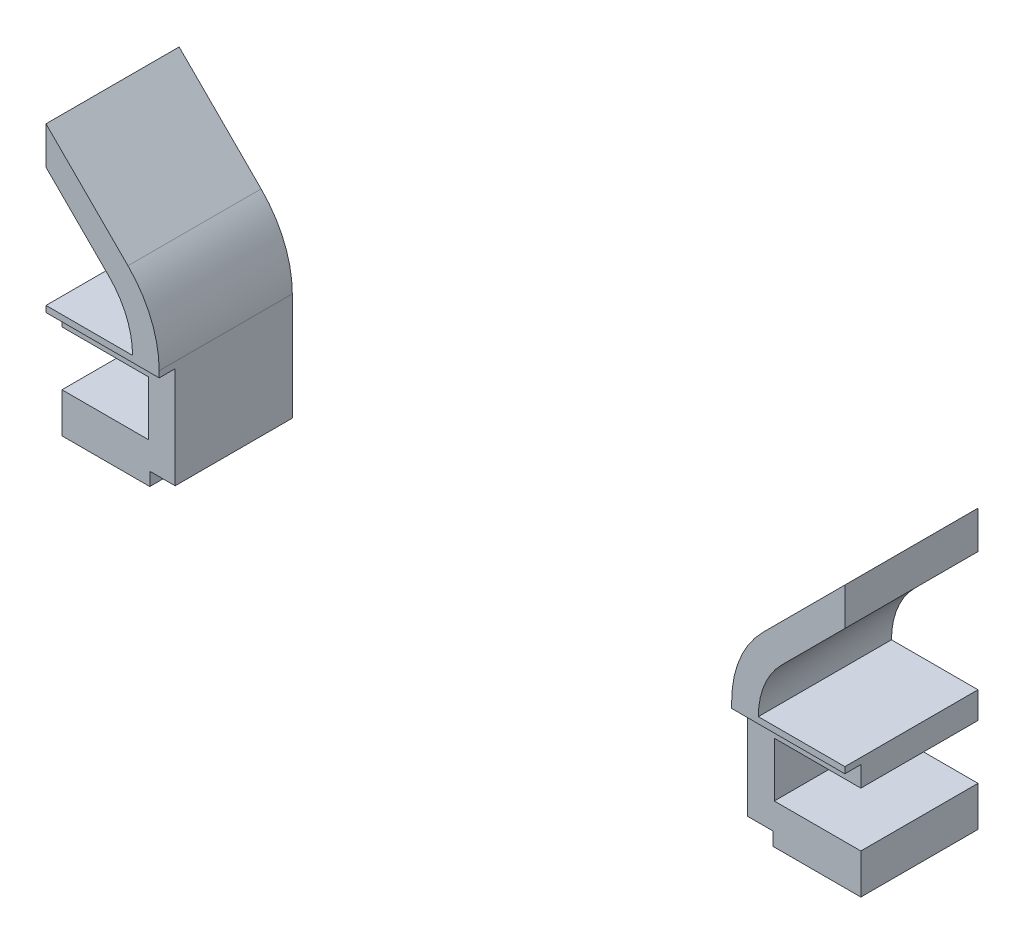
ISO-10303-21;
HEADER;
FILE_DESCRIPTION(('STEP AP214'),'2;1');
FILE_NAME('part.step','',(''),(''),'','','');
FILE_SCHEMA(('AUTOMOTIVE_DESIGN { 1 0 10303 214 1 1 1 1 }'));
ENDSEC;
DATA;
#1=APPLICATION_CONTEXT('core data for automotive mechanical design processes');
#2=APPLICATION_PROTOCOL_DEFINITION('international standard','automotive_design',2000,#1);
#3=PRODUCT_CONTEXT('',#1,'mechanical');
#4=PRODUCT('Part','Part','',(#3));
#5=PRODUCT_RELATED_PRODUCT_CATEGORY('part','',(#4));
#6=PRODUCT_DEFINITION_FORMATION('','',#4);
#7=PRODUCT_DEFINITION_CONTEXT('part definition',#1,'design');
#8=PRODUCT_DEFINITION('design','',#6,#7);
#9=PRODUCT_DEFINITION_SHAPE('','',#8);
#10=(LENGTH_UNIT() NAMED_UNIT(*) SI_UNIT(.MILLI.,.METRE.));
#11=(NAMED_UNIT(*) PLANE_ANGLE_UNIT() SI_UNIT($,.RADIAN.));
#12=(NAMED_UNIT(*) SI_UNIT($,.STERADIAN.) SOLID_ANGLE_UNIT());
#13=UNCERTAINTY_MEASURE_WITH_UNIT(LENGTH_MEASURE(1.E-05),#10,'distance_accuracy_value','');
#14=(GEOMETRIC_REPRESENTATION_CONTEXT(3) GLOBAL_UNCERTAINTY_ASSIGNED_CONTEXT((#13)) GLOBAL_UNIT_ASSIGNED_CONTEXT((#10,
#11,#12)) REPRESENTATION_CONTEXT('',''));
#15=CARTESIAN_POINT('',(0.,0.,0.));
#16=DIRECTION('',(0.,0.,1.));
#17=DIRECTION('',(1.,0.,0.));
#18=AXIS2_PLACEMENT_3D('',#15,#16,#17);
#19=CARTESIAN_POINT('',(-234.05,-125.,316.393160705231));
#20=DIRECTION('',(0.,1.,0.));
#21=DIRECTION('',(1.,0.,0.));
#22=AXIS2_PLACEMENT_3D('',#19,#20,#21);
#23=PLANE('',#22);
#24=DIRECTION('',(0.,0.,-1.));
#25=VECTOR('',#24,1.);
#26=CARTESIAN_POINT('',(-234.05,-125.,0.));
#27=LINE('',#26,#25);
#28=CARTESIAN_POINT('',(-234.05,-125.,88.));
#29=VERTEX_POINT('',#28);
#30=CARTESIAN_POINT('',(-234.05,-125.,0.));
#31=VERTEX_POINT('',#30);
#32=EDGE_CURVE('E191',#29,#31,#27,.T.);
#33=ORIENTED_EDGE('',*,*,#32,.T.);
#34=DIRECTION('',(-1.,0.,0.));
#35=VECTOR('',#34,1.);
#36=CARTESIAN_POINT('',(-234.05,-125.,0.));
#37=LINE('',#36,#35);
#38=CARTESIAN_POINT('',(-215.,-125.,0.));
#39=VERTEX_POINT('',#38);
#40=EDGE_CURVE('E185',#39,#31,#37,.T.);
#41=ORIENTED_EDGE('',*,*,#40,.F.);
#42=DIRECTION('',(0.,0.,-1.));
#43=VECTOR('',#42,1.);
#44=CARTESIAN_POINT('',(-215.,-125.,316.393160705231));
#45=LINE('',#44,#43);
#46=CARTESIAN_POINT('',(-215.,-125.,88.));
#47=VERTEX_POINT('',#46);
#48=EDGE_CURVE('E287',#47,#39,#45,.T.);
#49=ORIENTED_EDGE('',*,*,#48,.F.);
#50=DIRECTION('',(1.,0.,0.));
#51=VECTOR('',#50,1.);
#52=CARTESIAN_POINT('',(-300.,-125.,88.));
#53=LINE('',#52,#51);
#54=EDGE_CURVE('E208',#29,#47,#53,.T.);
#55=ORIENTED_EDGE('',*,*,#54,.F.);
#56=EDGE_LOOP('',(#33,#41,#49,#55));
#57=FACE_BOUND('',#56,.T.);
#58=ADVANCED_FACE('F43',(#57),#23,.F.);
#59=CARTESIAN_POINT('',(-295.,-44.1370849898474,0.));
#60=DIRECTION('',(0.,0.,1.));
#61=DIRECTION('',(-1.,0.,0.));
#62=AXIS2_PLACEMENT_3D('',#59,#60,#61);
#63=PLANE('',#62);
#64=DIRECTION('',(0.,1.,0.));
#65=VECTOR('',#64,1.);
#66=CARTESIAN_POINT('',(-300.,74.,0.));
#67=LINE('',#66,#65);
#68=CARTESIAN_POINT('',(-300.,45.7157287525382,0.));
#69=VERTEX_POINT('',#68);
#70=CARTESIAN_POINT('',(-300.,74.,0.));
#71=VERTEX_POINT('',#70);
#72=EDGE_CURVE('E226',#69,#71,#67,.T.);
#73=ORIENTED_EDGE('',*,*,#72,.T.);
#74=DIRECTION('',(0.707106781186548,-0.707106781186547,0.));
#75=VECTOR('',#74,1.);
#76=CARTESIAN_POINT('',(-300.,74.,0.));
#77=LINE('',#76,#75);
#78=CARTESIAN_POINT('',(-238.431457505076,12.4314575050767,0.));
#79=VERTEX_POINT('',#78);
#80=EDGE_CURVE('E244',#71,#79,#77,.T.);
#81=ORIENTED_EDGE('',*,*,#80,.T.);
#82=CARTESIAN_POINT('',(-295.,-44.1370849898474,0.));
#83=DIRECTION('',(0.,0.,-1.));
#84=DIRECTION('',(-1.,0.,0.));
#85=AXIS2_PLACEMENT_3D('',#82,#83,#84);
#86=CIRCLE('',#85,80.);
#87=CARTESIAN_POINT('',(-215.,-44.1370849898474,0.));
#88=VERTEX_POINT('',#87);
#89=EDGE_CURVE('E247',#79,#88,#86,.T.);
#90=ORIENTED_EDGE('',*,*,#89,.T.);
#91=DIRECTION('',(0.,-1.,0.));
#92=VECTOR('',#91,1.);
#93=CARTESIAN_POINT('',(-215.,-125.,0.));
#94=LINE('',#93,#92);
#95=EDGE_CURVE('E250',#88,#39,#94,.T.);
#96=ORIENTED_EDGE('',*,*,#95,.T.);
#97=ORIENTED_EDGE('',*,*,#40,.T.);
#98=DIRECTION('',(0.,1.,0.));
#99=VECTOR('',#98,1.);
#100=CARTESIAN_POINT('',(-234.05,-135.,0.));
#101=LINE('',#100,#99);
#102=CARTESIAN_POINT('',(-234.05,-135.,0.));
#103=VERTEX_POINT('',#102);
#104=EDGE_CURVE('E190',#103,#31,#101,.T.);
#105=ORIENTED_EDGE('',*,*,#104,.F.);
#106=DIRECTION('',(-1.,0.,0.));
#107=VECTOR('',#106,1.);
#108=CARTESIAN_POINT('',(-300.,-135.,0.));
#109=LINE('',#108,#107);
#110=CARTESIAN_POINT('',(-300.,-135.,0.));
#111=VERTEX_POINT('',#110);
#112=EDGE_CURVE('E170',#103,#111,#109,.T.);
#113=ORIENTED_EDGE('',*,*,#112,.T.);
#114=DIRECTION('',(0.,1.,0.));
#115=VECTOR('',#114,1.);
#116=CARTESIAN_POINT('',(-300.,-125.,0.));
#117=LINE('',#116,#115);
#118=CARTESIAN_POINT('',(-300.,-105.,0.));
#119=VERTEX_POINT('',#118);
#120=EDGE_CURVE('E177',#111,#119,#117,.T.);
#121=ORIENTED_EDGE('',*,*,#120,.T.);
#122=DIRECTION('',(1.,0.,0.));
#123=VECTOR('',#122,1.);
#124=CARTESIAN_POINT('',(-235.,-105.,0.));
#125=LINE('',#124,#123);
#126=CARTESIAN_POINT('',(-235.,-105.,0.));
#127=VERTEX_POINT('',#126);
#128=EDGE_CURVE('E184',#119,#127,#125,.T.);
#129=ORIENTED_EDGE('',*,*,#128,.T.);
#130=DIRECTION('',(0.,1.,0.));
#131=VECTOR('',#130,1.);
#132=CARTESIAN_POINT('',(-235.,-105.,0.));
#133=LINE('',#132,#131);
#134=CARTESIAN_POINT('',(-235.,-64.1370849898474,0.));
#135=VERTEX_POINT('',#134);
#136=EDGE_CURVE('E254',#127,#135,#133,.T.);
#137=ORIENTED_EDGE('',*,*,#136,.T.);
#138=DIRECTION('',(-1.,0.,0.));
#139=VECTOR('',#138,1.);
#140=CARTESIAN_POINT('',(-300.,-64.1370849898474,0.));
#141=LINE('',#140,#139);
#142=CARTESIAN_POINT('',(-300.,-64.1370849898474,0.));
#143=VERTEX_POINT('',#142);
#144=EDGE_CURVE('E257',#135,#143,#141,.T.);
#145=ORIENTED_EDGE('',*,*,#144,.T.);
#146=DIRECTION('',(0.,1.,0.));
#147=VECTOR('',#146,1.);
#148=CARTESIAN_POINT('',(-300.,-44.1370849898474,0.));
#149=LINE('',#148,#147);
#150=CARTESIAN_POINT('',(-300.,-44.1370849898474,0.));
#151=VERTEX_POINT('',#150);
#152=EDGE_CURVE('E260',#143,#151,#149,.T.);
#153=ORIENTED_EDGE('',*,*,#152,.T.);
#154=DIRECTION('',(1.,0.,0.));
#155=VECTOR('',#154,1.);
#156=CARTESIAN_POINT('',(-235.,-44.1370849898474,0.));
#157=LINE('',#156,#155);
#158=CARTESIAN_POINT('',(-235.,-44.1370849898474,0.));
#159=VERTEX_POINT('',#158);
#160=EDGE_CURVE('E263',#151,#159,#157,.T.);
#161=ORIENTED_EDGE('',*,*,#160,.T.);
#162=CARTESIAN_POINT('',(-295.,-44.1370849898474,0.));
#163=DIRECTION('',(0.,0.,1.));
#164=DIRECTION('',(-1.,0.,0.));
#165=AXIS2_PLACEMENT_3D('',#162,#163,#164);
#166=CIRCLE('',#165,60.);
#167=CARTESIAN_POINT('',(-252.573593128807,-1.71067811865435,0.));
#168=VERTEX_POINT('',#167);
#169=EDGE_CURVE('E266',#159,#168,#166,.T.);
#170=ORIENTED_EDGE('',*,*,#169,.T.);
#171=DIRECTION('',(-0.707106781186549,0.707106781186546,0.));
#172=VECTOR('',#171,1.);
#173=CARTESIAN_POINT('',(-300.,45.7157287525382,0.));
#174=LINE('',#173,#172);
#175=EDGE_CURVE('E269',#168,#69,#174,.T.);
#176=ORIENTED_EDGE('',*,*,#175,.T.);
#177=EDGE_LOOP('',(#73,#81,#90,#96,#97,#105,#113,#121,#129,#137,#145,#153,#161,#170,#176));
#178=FACE_BOUND('',#177,.T.);
#179=ADVANCED_FACE('F188',(#178),#63,.F.);
#180=CARTESIAN_POINT('',(-300.,45.7157287525382,316.393160705231));
#181=DIRECTION('',(0.707106781186546,0.707106781186549,0.));
#182=DIRECTION('',(0.707106781186549,-0.707106781186546,0.));
#183=AXIS2_PLACEMENT_3D('',#180,#181,#182);
#184=PLANE('',#183);
#185=DIRECTION('',(0.,0.,-1.));
#186=VECTOR('',#185,1.);
#187=CARTESIAN_POINT('',(-300.,45.7157287525382,316.393160705231));
#188=LINE('',#187,#186);
#189=CARTESIAN_POINT('',(-300.,45.7157287525382,100.));
#190=VERTEX_POINT('',#189);
#191=EDGE_CURVE('E272',#190,#69,#188,.T.);
#192=ORIENTED_EDGE('',*,*,#191,.T.);
#193=ORIENTED_EDGE('',*,*,#175,.F.);
#194=DIRECTION('',(0.,0.,-1.));
#195=VECTOR('',#194,1.);
#196=CARTESIAN_POINT('',(-252.573593128807,-1.71067811865435,316.393160705231));
#197=LINE('',#196,#195);
#198=CARTESIAN_POINT('',(-252.573593128807,-1.71067811865435,100.));
#199=VERTEX_POINT('',#198);
#200=EDGE_CURVE('E274',#199,#168,#197,.T.);
#201=ORIENTED_EDGE('',*,*,#200,.F.);
#202=DIRECTION('',(0.707106781186549,-0.707106781186546,0.));
#203=VECTOR('',#202,1.);
#204=CARTESIAN_POINT('',(-300.,45.7157287525382,100.));
#205=LINE('',#204,#203);
#206=EDGE_CURVE('E47',#190,#199,#205,.T.);
#207=ORIENTED_EDGE('',*,*,#206,.F.);
#208=EDGE_LOOP('',(#192,#193,#201,#207));
#209=FACE_BOUND('',#208,.T.);
#210=ADVANCED_FACE('F307',(#209),#184,.F.);
#211=CARTESIAN_POINT('',(-295.,-44.1370849898474,316.393160705231));
#212=DIRECTION('',(0.,0.,-1.));
#213=DIRECTION('',(1.,0.,0.));
#214=AXIS2_PLACEMENT_3D('',#211,#212,#213);
#215=CYLINDRICAL_SURFACE('',#214,60.);
#216=ORIENTED_EDGE('',*,*,#200,.T.);
#217=ORIENTED_EDGE('',*,*,#169,.F.);
#218=DIRECTION('',(0.,0.,-1.));
#219=VECTOR('',#218,1.);
#220=CARTESIAN_POINT('',(-235.,-44.1370849898474,316.393160705231));
#221=LINE('',#220,#219);
#222=CARTESIAN_POINT('',(-235.,-44.1370849898474,100.));
#223=VERTEX_POINT('',#222);
#224=EDGE_CURVE('E276',#223,#159,#221,.T.);
#225=ORIENTED_EDGE('',*,*,#224,.F.);
#226=CARTESIAN_POINT('',(-295.,-44.1370849898474,100.));
#227=DIRECTION('',(0.,0.,1.));
#228=DIRECTION('',(1.,0.,0.));
#229=AXIS2_PLACEMENT_3D('',#226,#227,#228);
#230=CIRCLE('',#229,60.);
#231=EDGE_CURVE('E227',#199,#223,#230,.F.);
#232=ORIENTED_EDGE('',*,*,#231,.F.);
#233=EDGE_LOOP('',(#216,#217,#225,#232));
#234=FACE_BOUND('',#233,.T.);
#235=ADVANCED_FACE('F310',(#234),#215,.F.);
#236=CARTESIAN_POINT('',(-235.,-44.1370849898474,316.393160705231));
#237=DIRECTION('',(0.,-1.,0.));
#238=DIRECTION('',(-1.,0.,0.));
#239=AXIS2_PLACEMENT_3D('',#236,#237,#238);
#240=PLANE('',#239);
#241=ORIENTED_EDGE('',*,*,#224,.T.);
#242=ORIENTED_EDGE('',*,*,#160,.F.);
#243=DIRECTION('',(0.,0.,-1.));
#244=VECTOR('',#243,1.);
#245=CARTESIAN_POINT('',(-300.,-44.1370849898474,316.393160705231));
#246=LINE('',#245,#244);
#247=CARTESIAN_POINT('',(-300.,-44.1370849898474,100.));
#248=VERTEX_POINT('',#247);
#249=EDGE_CURVE('E278',#248,#151,#246,.T.);
#250=ORIENTED_EDGE('',*,*,#249,.F.);
#251=DIRECTION('',(-1.,0.,0.));
#252=VECTOR('',#251,1.);
#253=CARTESIAN_POINT('',(-235.,-44.1370849898474,100.));
#254=LINE('',#253,#252);
#255=EDGE_CURVE('E230',#223,#248,#254,.T.);
#256=ORIENTED_EDGE('',*,*,#255,.F.);
#257=EDGE_LOOP('',(#241,#242,#250,#256));
#258=FACE_BOUND('',#257,.T.);
#259=ADVANCED_FACE('F313',(#258),#240,.F.);
#260=CARTESIAN_POINT('',(-300.,-44.1370849898474,316.393160705231));
#261=DIRECTION('',(1.,0.,0.));
#262=DIRECTION('',(0.,0.,1.));
#263=AXIS2_PLACEMENT_3D('',#260,#261,#262);
#264=PLANE('',#263);
#265=DIRECTION('',(0.,0.,-1.));
#266=VECTOR('',#265,1.);
#267=CARTESIAN_POINT('',(-300.,-48.8000000000001,100.));
#268=LINE('',#267,#266);
#269=CARTESIAN_POINT('',(-300.,-48.8000000000001,100.));
#270=VERTEX_POINT('',#269);
#271=CARTESIAN_POINT('',(-300.,-48.8000000000001,88.));
#272=VERTEX_POINT('',#271);
#273=EDGE_CURVE('E205',#270,#272,#268,.T.);
#274=ORIENTED_EDGE('',*,*,#273,.F.);
#275=DIRECTION('',(0.,-1.,0.));
#276=VECTOR('',#275,1.);
#277=CARTESIAN_POINT('',(-300.,-44.1370849898474,100.));
#278=LINE('',#277,#276);
#279=EDGE_CURVE('E233',#248,#270,#278,.T.);
#280=ORIENTED_EDGE('',*,*,#279,.F.);
#281=ORIENTED_EDGE('',*,*,#249,.T.);
#282=ORIENTED_EDGE('',*,*,#152,.F.);
#283=DIRECTION('',(0.,0.,-1.));
#284=VECTOR('',#283,1.);
#285=CARTESIAN_POINT('',(-300.,-64.1370849898474,316.393160705231));
#286=LINE('',#285,#284);
#287=CARTESIAN_POINT('',(-300.,-64.1370849898474,88.));
#288=VERTEX_POINT('',#287);
#289=EDGE_CURVE('E280',#288,#143,#286,.T.);
#290=ORIENTED_EDGE('',*,*,#289,.F.);
#291=DIRECTION('',(0.,-1.,0.));
#292=VECTOR('',#291,1.);
#293=CARTESIAN_POINT('',(-300.,-48.8000000000001,88.));
#294=LINE('',#293,#292);
#295=EDGE_CURVE('E202',#272,#288,#294,.T.);
#296=ORIENTED_EDGE('',*,*,#295,.F.);
#297=EDGE_LOOP('',(#274,#280,#281,#282,#290,#296));
#298=FACE_BOUND('',#297,.T.);
#299=ADVANCED_FACE('F318',(#298),#264,.F.);
#300=CARTESIAN_POINT('',(-300.,-64.1370849898474,316.393160705231));
#301=DIRECTION('',(0.,1.,0.));
#302=DIRECTION('',(0.,0.,1.));
#303=AXIS2_PLACEMENT_3D('',#300,#301,#302);
#304=PLANE('',#303);
#305=ORIENTED_EDGE('',*,*,#289,.T.);
#306=ORIENTED_EDGE('',*,*,#144,.F.);
#307=DIRECTION('',(0.,0.,-1.));
#308=VECTOR('',#307,1.);
#309=CARTESIAN_POINT('',(-235.,-64.1370849898474,316.393160705231));
#310=LINE('',#309,#308);
#311=CARTESIAN_POINT('',(-235.,-64.1370849898474,88.));
#312=VERTEX_POINT('',#311);
#313=EDGE_CURVE('E282',#312,#135,#310,.T.);
#314=ORIENTED_EDGE('',*,*,#313,.F.);
#315=DIRECTION('',(1.,0.,0.));
#316=VECTOR('',#315,1.);
#317=CARTESIAN_POINT('',(-300.,-64.1370849898474,88.));
#318=LINE('',#317,#316);
#319=EDGE_CURVE('E223',#288,#312,#318,.T.);
#320=ORIENTED_EDGE('',*,*,#319,.F.);
#321=EDGE_LOOP('',(#305,#306,#314,#320));
#322=FACE_BOUND('',#321,.T.);
#323=ADVANCED_FACE('F421',(#322),#304,.F.);
#324=CARTESIAN_POINT('',(-235.,-105.,316.393160705231));
#325=DIRECTION('',(1.,0.,0.));
#326=DIRECTION('',(0.,0.,1.));
#327=AXIS2_PLACEMENT_3D('',#324,#325,#326);
#328=PLANE('',#327);
#329=ORIENTED_EDGE('',*,*,#313,.T.);
#330=ORIENTED_EDGE('',*,*,#136,.F.);
#331=DIRECTION('',(0.,0.,-1.));
#332=VECTOR('',#331,1.);
#333=CARTESIAN_POINT('',(-235.,-105.,316.393160705231));
#334=LINE('',#333,#332);
#335=CARTESIAN_POINT('',(-235.,-105.,88.));
#336=VERTEX_POINT('',#335);
#337=EDGE_CURVE('E284',#336,#127,#334,.T.);
#338=ORIENTED_EDGE('',*,*,#337,.F.);
#339=DIRECTION('',(0.,-1.,0.));
#340=VECTOR('',#339,1.);
#341=CARTESIAN_POINT('',(-235.,-105.,88.));
#342=LINE('',#341,#340);
#343=EDGE_CURVE('E220',#312,#336,#342,.T.);
#344=ORIENTED_EDGE('',*,*,#343,.F.);
#345=EDGE_LOOP('',(#329,#330,#338,#344));
#346=FACE_BOUND('',#345,.T.);
#347=ADVANCED_FACE('F424',(#346),#328,.F.);
#348=CARTESIAN_POINT('',(-235.,-105.,316.393160705231));
#349=DIRECTION('',(0.,-1.,0.));
#350=DIRECTION('',(0.,0.,-1.));
#351=AXIS2_PLACEMENT_3D('',#348,#349,#350);
#352=PLANE('',#351);
#353=ORIENTED_EDGE('',*,*,#337,.T.);
#354=ORIENTED_EDGE('',*,*,#128,.F.);
#355=DIRECTION('',(0.,0.,-1.));
#356=VECTOR('',#355,1.);
#357=CARTESIAN_POINT('',(-300.,-105.,316.393160705231));
#358=LINE('',#357,#356);
#359=CARTESIAN_POINT('',(-300.,-105.,88.));
#360=VERTEX_POINT('',#359);
#361=EDGE_CURVE('E180',#360,#119,#358,.T.);
#362=ORIENTED_EDGE('',*,*,#361,.F.);
#363=DIRECTION('',(-1.,0.,0.));
#364=VECTOR('',#363,1.);
#365=CARTESIAN_POINT('',(-235.,-105.,88.));
#366=LINE('',#365,#364);
#367=EDGE_CURVE('E215',#336,#360,#366,.T.);
#368=ORIENTED_EDGE('',*,*,#367,.F.);
#369=EDGE_LOOP('',(#353,#354,#362,#368));
#370=FACE_BOUND('',#369,.T.);
#371=ADVANCED_FACE('F427',(#370),#352,.F.);
#372=CARTESIAN_POINT('',(-300.,-125.,316.393160705231));
#373=DIRECTION('',(1.,0.,0.));
#374=DIRECTION('',(0.,0.,1.));
#375=AXIS2_PLACEMENT_3D('',#372,#373,#374);
#376=PLANE('',#375);
#377=ORIENTED_EDGE('',*,*,#361,.T.);
#378=ORIENTED_EDGE('',*,*,#120,.F.);
#379=DIRECTION('',(0.,0.,1.));
#380=VECTOR('',#379,1.);
#381=CARTESIAN_POINT('',(-300.,-135.,88.));
#382=LINE('',#381,#380);
#383=CARTESIAN_POINT('',(-300.,-135.,88.));
#384=VERTEX_POINT('',#383);
#385=EDGE_CURVE('E166',#111,#384,#382,.T.);
#386=ORIENTED_EDGE('',*,*,#385,.T.);
#387=EDGE_CURVE('E206',#360,#384,#294,.T.);
#388=ORIENTED_EDGE('',*,*,#387,.F.);
#389=EDGE_LOOP('',(#377,#378,#386,#388));
#390=FACE_BOUND('',#389,.T.);
#391=ADVANCED_FACE('F178',(#390),#376,.F.);
#392=CARTESIAN_POINT('',(-215.,-125.,316.393160705231));
#393=DIRECTION('',(-1.,0.,0.));
#394=DIRECTION('',(0.,0.,-1.));
#395=AXIS2_PLACEMENT_3D('',#392,#393,#394);
#396=PLANE('',#395);
#397=ORIENTED_EDGE('',*,*,#48,.T.);
#398=ORIENTED_EDGE('',*,*,#95,.F.);
#399=DIRECTION('',(0.,0.,-1.));
#400=VECTOR('',#399,1.);
#401=CARTESIAN_POINT('',(-215.,-44.1370849898474,316.393160705231));
#402=LINE('',#401,#400);
#403=CARTESIAN_POINT('',(-215.,-44.1370849898474,100.));
#404=VERTEX_POINT('',#403);
#405=EDGE_CURVE('E290',#404,#88,#402,.T.);
#406=ORIENTED_EDGE('',*,*,#405,.F.);
#407=DIRECTION('',(0.,1.,0.));
#408=VECTOR('',#407,1.);
#409=CARTESIAN_POINT('',(-215.,-125.,100.));
#410=LINE('',#409,#408);
#411=CARTESIAN_POINT('',(-215.,-48.8000000000001,100.));
#412=VERTEX_POINT('',#411);
#413=EDGE_CURVE('E235',#412,#404,#410,.T.);
#414=ORIENTED_EDGE('',*,*,#413,.F.);
#415=DIRECTION('',(0.,0.,-1.));
#416=VECTOR('',#415,1.);
#417=CARTESIAN_POINT('',(-215.,-48.8000000000001,100.));
#418=LINE('',#417,#416);
#419=CARTESIAN_POINT('',(-215.,-48.8000000000001,88.));
#420=VERTEX_POINT('',#419);
#421=EDGE_CURVE('E210',#412,#420,#418,.T.);
#422=ORIENTED_EDGE('',*,*,#421,.T.);
#423=DIRECTION('',(0.,-1.,0.));
#424=VECTOR('',#423,1.);
#425=CARTESIAN_POINT('',(-215.,-48.8000000000001,88.));
#426=LINE('',#425,#424);
#427=EDGE_CURVE('E201',#420,#47,#426,.T.);
#428=ORIENTED_EDGE('',*,*,#427,.T.);
#429=EDGE_LOOP('',(#397,#398,#406,#414,#422,#428));
#430=FACE_BOUND('',#429,.T.);
#431=ADVANCED_FACE('F326',(#430),#396,.F.);
#432=CARTESIAN_POINT('',(-295.,-44.1370849898474,316.393160705231));
#433=DIRECTION('',(0.,0.,-1.));
#434=DIRECTION('',(1.,0.,0.));
#435=AXIS2_PLACEMENT_3D('',#432,#433,#434);
#436=CYLINDRICAL_SURFACE('',#435,80.);
#437=ORIENTED_EDGE('',*,*,#405,.T.);
#438=ORIENTED_EDGE('',*,*,#89,.F.);
#439=DIRECTION('',(0.,0.,-1.));
#440=VECTOR('',#439,1.);
#441=CARTESIAN_POINT('',(-238.431457505076,12.4314575050767,316.393160705231));
#442=LINE('',#441,#440);
#443=CARTESIAN_POINT('',(-238.431457505076,12.4314575050767,100.));
#444=VERTEX_POINT('',#443);
#445=EDGE_CURVE('E292',#444,#79,#442,.T.);
#446=ORIENTED_EDGE('',*,*,#445,.F.);
#447=CARTESIAN_POINT('',(-295.,-44.1370849898474,100.));
#448=DIRECTION('',(0.,0.,1.));
#449=DIRECTION('',(1.,0.,0.));
#450=AXIS2_PLACEMENT_3D('',#447,#448,#449);
#451=CIRCLE('',#450,80.);
#452=EDGE_CURVE('E238',#404,#444,#451,.T.);
#453=ORIENTED_EDGE('',*,*,#452,.F.);
#454=EDGE_LOOP('',(#437,#438,#446,#453));
#455=FACE_BOUND('',#454,.T.);
#456=ADVANCED_FACE('F332',(#455),#436,.T.);
#457=CARTESIAN_POINT('',(-300.,74.,316.393160705231));
#458=DIRECTION('',(-0.707106781186547,-0.707106781186548,0.));
#459=DIRECTION('',(-0.707106781186548,0.707106781186547,0.));
#460=AXIS2_PLACEMENT_3D('',#457,#458,#459);
#461=PLANE('',#460);
#462=ORIENTED_EDGE('',*,*,#445,.T.);
#463=ORIENTED_EDGE('',*,*,#80,.F.);
#464=DIRECTION('',(0.,0.,-1.));
#465=VECTOR('',#464,1.);
#466=CARTESIAN_POINT('',(-300.,74.,316.393160705231));
#467=LINE('',#466,#465);
#468=CARTESIAN_POINT('',(-300.,74.,100.));
#469=VERTEX_POINT('',#468);
#470=EDGE_CURVE('E293',#469,#71,#467,.T.);
#471=ORIENTED_EDGE('',*,*,#470,.F.);
#472=DIRECTION('',(-0.707106781186548,0.707106781186547,0.));
#473=VECTOR('',#472,1.);
#474=CARTESIAN_POINT('',(-300.,74.,100.));
#475=LINE('',#474,#473);
#476=EDGE_CURVE('E52',#444,#469,#475,.T.);
#477=ORIENTED_EDGE('',*,*,#476,.F.);
#478=EDGE_LOOP('',(#462,#463,#471,#477));
#479=FACE_BOUND('',#478,.T.);
#480=ADVANCED_FACE('F334',(#479),#461,.F.);
#481=CARTESIAN_POINT('',(-300.,74.,316.393160705231));
#482=DIRECTION('',(1.,0.,0.));
#483=DIRECTION('',(0.,-1.,0.));
#484=AXIS2_PLACEMENT_3D('',#481,#482,#483);
#485=PLANE('',#484);
#486=ORIENTED_EDGE('',*,*,#470,.T.);
#487=ORIENTED_EDGE('',*,*,#72,.F.);
#488=ORIENTED_EDGE('',*,*,#191,.F.);
#489=DIRECTION('',(0.,-1.,0.));
#490=VECTOR('',#489,1.);
#491=CARTESIAN_POINT('',(-300.,74.,100.));
#492=LINE('',#491,#490);
#493=EDGE_CURVE('E12',#469,#190,#492,.T.);
#494=ORIENTED_EDGE('',*,*,#493,.F.);
#495=EDGE_LOOP('',(#486,#487,#488,#494));
#496=FACE_BOUND('',#495,.T.);
#497=ADVANCED_FACE('F45',(#496),#485,.F.);
#498=CARTESIAN_POINT('',(0.,0.,100.));
#499=DIRECTION('',(0.,0.,-1.));
#500=DIRECTION('',(0.,-1.,0.));
#501=AXIS2_PLACEMENT_3D('',#498,#499,#500);
#502=PLANE('',#501);
#503=ORIENTED_EDGE('',*,*,#413,.T.);
#504=ORIENTED_EDGE('',*,*,#452,.T.);
#505=ORIENTED_EDGE('',*,*,#476,.T.);
#506=ORIENTED_EDGE('',*,*,#493,.T.);
#507=ORIENTED_EDGE('',*,*,#206,.T.);
#508=ORIENTED_EDGE('',*,*,#231,.T.);
#509=ORIENTED_EDGE('',*,*,#255,.T.);
#510=ORIENTED_EDGE('',*,*,#279,.T.);
#511=DIRECTION('',(1.,0.,0.));
#512=VECTOR('',#511,1.);
#513=CARTESIAN_POINT('',(-300.,-48.8000000000001,100.));
#514=LINE('',#513,#512);
#515=EDGE_CURVE('E68',#270,#412,#514,.T.);
#516=ORIENTED_EDGE('',*,*,#515,.T.);
#517=EDGE_LOOP('',(#503,#504,#505,#506,#507,#508,#509,#510,#516));
#518=FACE_BOUND('',#517,.T.);
#519=ADVANCED_FACE('F302',(#518),#502,.F.);
#520=CARTESIAN_POINT('',(-300.,-48.8000000000001,88.));
#521=DIRECTION('',(0.,0.,-1.));
#522=DIRECTION('',(1.,0.,0.));
#523=AXIS2_PLACEMENT_3D('',#520,#521,#522);
#524=PLANE('',#523);
#525=ORIENTED_EDGE('',*,*,#295,.T.);
#526=ORIENTED_EDGE('',*,*,#319,.T.);
#527=ORIENTED_EDGE('',*,*,#343,.T.);
#528=ORIENTED_EDGE('',*,*,#367,.T.);
#529=ORIENTED_EDGE('',*,*,#387,.T.);
#530=DIRECTION('',(1.,0.,0.));
#531=VECTOR('',#530,1.);
#532=CARTESIAN_POINT('',(-234.05,-135.,88.));
#533=LINE('',#532,#531);
#534=CARTESIAN_POINT('',(-234.05,-135.,88.));
#535=VERTEX_POINT('',#534);
#536=EDGE_CURVE('E172',#384,#535,#533,.T.);
#537=ORIENTED_EDGE('',*,*,#536,.T.);
#538=DIRECTION('',(0.,1.,0.));
#539=VECTOR('',#538,1.);
#540=CARTESIAN_POINT('',(-234.05,-135.,88.));
#541=LINE('',#540,#539);
#542=EDGE_CURVE('E60',#535,#29,#541,.T.);
#543=ORIENTED_EDGE('',*,*,#542,.T.);
#544=ORIENTED_EDGE('',*,*,#54,.T.);
#545=ORIENTED_EDGE('',*,*,#427,.F.);
#546=DIRECTION('',(1.,0.,0.));
#547=VECTOR('',#546,1.);
#548=CARTESIAN_POINT('',(-300.,-48.8000000000001,88.));
#549=LINE('',#548,#547);
#550=EDGE_CURVE('E213',#272,#420,#549,.T.);
#551=ORIENTED_EDGE('',*,*,#550,.F.);
#552=EDGE_LOOP('',(#525,#526,#527,#528,#529,#537,#543,#544,#545,#551));
#553=FACE_BOUND('',#552,.T.);
#554=ADVANCED_FACE('F323',(#553),#524,.F.);
#555=CARTESIAN_POINT('',(-300.,-48.8000000000001,100.));
#556=DIRECTION('',(0.,1.,0.));
#557=DIRECTION('',(0.,0.,1.));
#558=AXIS2_PLACEMENT_3D('',#555,#556,#557);
#559=PLANE('',#558);
#560=ORIENTED_EDGE('',*,*,#421,.F.);
#561=ORIENTED_EDGE('',*,*,#515,.F.);
#562=ORIENTED_EDGE('',*,*,#273,.T.);
#563=ORIENTED_EDGE('',*,*,#550,.T.);
#564=EDGE_LOOP('',(#560,#561,#562,#563));
#565=FACE_BOUND('',#564,.T.);
#566=ADVANCED_FACE('F320',(#565),#559,.F.);
#567=CARTESIAN_POINT('',(-234.05,-135.,0.));
#568=DIRECTION('',(-1.,0.,0.));
#569=DIRECTION('',(0.,1.,0.));
#570=AXIS2_PLACEMENT_3D('',#567,#568,#569);
#571=PLANE('',#570);
#572=ORIENTED_EDGE('',*,*,#32,.F.);
#573=ORIENTED_EDGE('',*,*,#542,.F.);
#574=DIRECTION('',(0.,0.,-1.));
#575=VECTOR('',#574,1.);
#576=CARTESIAN_POINT('',(-234.05,-135.,0.));
#577=LINE('',#576,#575);
#578=EDGE_CURVE('E197',#535,#103,#577,.T.);
#579=ORIENTED_EDGE('',*,*,#578,.T.);
#580=ORIENTED_EDGE('',*,*,#104,.T.);
#581=EDGE_LOOP('',(#572,#573,#579,#580));
#582=FACE_BOUND('',#581,.T.);
#583=ADVANCED_FACE('F391',(#582),#571,.F.);
#584=CARTESIAN_POINT('',(0.,-135.,0.));
#585=DIRECTION('',(0.,1.,0.));
#586=DIRECTION('',(1.,0.,0.));
#587=AXIS2_PLACEMENT_3D('',#584,#585,#586);
#588=PLANE('',#587);
#589=ORIENTED_EDGE('',*,*,#112,.F.);
#590=ORIENTED_EDGE('',*,*,#578,.F.);
#591=ORIENTED_EDGE('',*,*,#536,.F.);
#592=ORIENTED_EDGE('',*,*,#385,.F.);
#593=EDGE_LOOP('',(#589,#590,#591,#592));
#594=FACE_BOUND('',#593,.T.);
#595=ADVANCED_FACE('F168',(#594),#588,.F.);
#596=CLOSED_SHELL('',(#58,#179,#210,#235,#259,#299,#323,#347,#371,#391,#431,#456,#480,#497,#519,
#554,#566,#583,#595));
#597=MANIFOLD_SOLID_BREP('B2',#596);
#598=CARTESIAN_POINT('',(234.05,-125.,316.393160705231));
#599=DIRECTION('',(0.,1.,0.));
#600=DIRECTION('',(-1.,0.,0.));
#601=AXIS2_PLACEMENT_3D('',#598,#599,#600);
#602=PLANE('',#601);
#603=DIRECTION('',(0.,0.,-1.));
#604=VECTOR('',#603,1.);
#605=CARTESIAN_POINT('',(234.05,-125.,0.));
#606=LINE('',#605,#604);
#607=CARTESIAN_POINT('',(234.05,-125.,88.));
#608=VERTEX_POINT('',#607);
#609=CARTESIAN_POINT('',(234.05,-125.,0.));
#610=VERTEX_POINT('',#609);
#611=EDGE_CURVE('E536',#608,#610,#606,.T.);
#612=ORIENTED_EDGE('',*,*,#611,.F.);
#613=DIRECTION('',(-1.,0.,0.));
#614=VECTOR('',#613,1.);
#615=CARTESIAN_POINT('',(300.,-125.,88.));
#616=LINE('',#615,#614);
#617=CARTESIAN_POINT('',(215.,-125.,88.));
#618=VERTEX_POINT('',#617);
#619=EDGE_CURVE('E682',#608,#618,#616,.T.);
#620=ORIENTED_EDGE('',*,*,#619,.T.);
#621=DIRECTION('',(0.,0.,-1.));
#622=VECTOR('',#621,1.);
#623=CARTESIAN_POINT('',(215.,-125.,316.393160705231));
#624=LINE('',#623,#622);
#625=CARTESIAN_POINT('',(215.,-125.,0.));
#626=VERTEX_POINT('',#625);
#627=EDGE_CURVE('E766',#618,#626,#624,.T.);
#628=ORIENTED_EDGE('',*,*,#627,.T.);
#629=DIRECTION('',(1.,0.,0.));
#630=VECTOR('',#629,1.);
#631=CARTESIAN_POINT('',(234.05,-125.,0.));
#632=LINE('',#631,#630);
#633=EDGE_CURVE('E653',#626,#610,#632,.T.);
#634=ORIENTED_EDGE('',*,*,#633,.T.);
#635=EDGE_LOOP('',(#612,#620,#628,#634));
#636=FACE_BOUND('',#635,.T.);
#637=ADVANCED_FACE('F519',(#636),#602,.F.);
#638=CARTESIAN_POINT('',(295.,-44.1370849898474,0.));
#639=DIRECTION('',(0.,0.,1.));
#640=DIRECTION('',(1.,0.,0.));
#641=AXIS2_PLACEMENT_3D('',#638,#639,#640);
#642=PLANE('',#641);
#643=DIRECTION('',(0.,1.,0.));
#644=VECTOR('',#643,1.);
#645=CARTESIAN_POINT('',(300.,74.,0.));
#646=LINE('',#645,#644);
#647=CARTESIAN_POINT('',(300.,45.7157287525382,0.));
#648=VERTEX_POINT('',#647);
#649=CARTESIAN_POINT('',(300.,74.,0.));
#650=VERTEX_POINT('',#649);
#651=EDGE_CURVE('E702',#648,#650,#646,.T.);
#652=ORIENTED_EDGE('',*,*,#651,.F.);
#653=DIRECTION('',(0.707106781186549,0.707106781186546,0.));
#654=VECTOR('',#653,1.);
#655=CARTESIAN_POINT('',(300.,45.7157287525382,0.));
#656=LINE('',#655,#654);
#657=CARTESIAN_POINT('',(252.573593128807,-1.71067811865435,0.));
#658=VERTEX_POINT('',#657);
#659=EDGE_CURVE('E747',#658,#648,#656,.T.);
#660=ORIENTED_EDGE('',*,*,#659,.F.);
#661=CARTESIAN_POINT('',(295.,-44.1370849898474,0.));
#662=DIRECTION('',(0.,0.,-1.));
#663=DIRECTION('',(1.,0.,0.));
#664=AXIS2_PLACEMENT_3D('',#661,#662,#663);
#665=CIRCLE('',#664,60.);
#666=CARTESIAN_POINT('',(235.,-44.1370849898474,0.));
#667=VERTEX_POINT('',#666);
#668=EDGE_CURVE('E744',#667,#658,#665,.T.);
#669=ORIENTED_EDGE('',*,*,#668,.F.);
#670=DIRECTION('',(-1.,0.,0.));
#671=VECTOR('',#670,1.);
#672=CARTESIAN_POINT('',(235.,-44.1370849898474,0.));
#673=LINE('',#672,#671);
#674=CARTESIAN_POINT('',(300.,-44.1370849898474,0.));
#675=VERTEX_POINT('',#674);
#676=EDGE_CURVE('E741',#675,#667,#673,.T.);
#677=ORIENTED_EDGE('',*,*,#676,.F.);
#678=DIRECTION('',(0.,1.,0.));
#679=VECTOR('',#678,1.);
#680=CARTESIAN_POINT('',(300.,-44.1370849898474,0.));
#681=LINE('',#680,#679);
#682=CARTESIAN_POINT('',(300.,-64.1370849898474,0.));
#683=VERTEX_POINT('',#682);
#684=EDGE_CURVE('E738',#683,#675,#681,.T.);
#685=ORIENTED_EDGE('',*,*,#684,.F.);
#686=DIRECTION('',(1.,0.,0.));
#687=VECTOR('',#686,1.);
#688=CARTESIAN_POINT('',(300.,-64.1370849898474,0.));
#689=LINE('',#688,#687);
#690=CARTESIAN_POINT('',(235.,-64.1370849898474,0.));
#691=VERTEX_POINT('',#690);
#692=EDGE_CURVE('E735',#691,#683,#689,.T.);
#693=ORIENTED_EDGE('',*,*,#692,.F.);
#694=DIRECTION('',(0.,1.,0.));
#695=VECTOR('',#694,1.);
#696=CARTESIAN_POINT('',(235.,-105.,0.));
#697=LINE('',#696,#695);
#698=CARTESIAN_POINT('',(235.,-105.,0.));
#699=VERTEX_POINT('',#698);
#700=EDGE_CURVE('E732',#699,#691,#697,.T.);
#701=ORIENTED_EDGE('',*,*,#700,.F.);
#702=DIRECTION('',(-1.,0.,0.));
#703=VECTOR('',#702,1.);
#704=CARTESIAN_POINT('',(235.,-105.,0.));
#705=LINE('',#704,#703);
#706=CARTESIAN_POINT('',(300.,-105.,0.));
#707=VERTEX_POINT('',#706);
#708=EDGE_CURVE('E650',#707,#699,#705,.T.);
#709=ORIENTED_EDGE('',*,*,#708,.F.);
#710=DIRECTION('',(0.,1.,0.));
#711=VECTOR('',#710,1.);
#712=CARTESIAN_POINT('',(300.,-125.,0.));
#713=LINE('',#712,#711);
#714=CARTESIAN_POINT('',(300.,-135.,0.));
#715=VERTEX_POINT('',#714);
#716=EDGE_CURVE('E641',#715,#707,#713,.T.);
#717=ORIENTED_EDGE('',*,*,#716,.F.);
#718=DIRECTION('',(1.,0.,0.));
#719=VECTOR('',#718,1.);
#720=CARTESIAN_POINT('',(300.,-135.,0.));
#721=LINE('',#720,#719);
#722=CARTESIAN_POINT('',(234.05,-135.,0.));
#723=VERTEX_POINT('',#722);
#724=EDGE_CURVE('E647',#723,#715,#721,.T.);
#725=ORIENTED_EDGE('',*,*,#724,.F.);
#726=DIRECTION('',(0.,1.,0.));
#727=VECTOR('',#726,1.);
#728=CARTESIAN_POINT('',(234.05,-135.,0.));
#729=LINE('',#728,#727);
#730=EDGE_CURVE('E671',#723,#610,#729,.T.);
#731=ORIENTED_EDGE('',*,*,#730,.T.);
#732=ORIENTED_EDGE('',*,*,#633,.F.);
#733=DIRECTION('',(0.,-1.,0.));
#734=VECTOR('',#733,1.);
#735=CARTESIAN_POINT('',(215.,-125.,0.));
#736=LINE('',#735,#734);
#737=CARTESIAN_POINT('',(215.,-44.1370849898474,0.));
#738=VERTEX_POINT('',#737);
#739=EDGE_CURVE('E727',#738,#626,#736,.T.);
#740=ORIENTED_EDGE('',*,*,#739,.F.);
#741=CARTESIAN_POINT('',(295.,-44.1370849898474,0.));
#742=DIRECTION('',(0.,0.,1.));
#743=DIRECTION('',(1.,0.,0.));
#744=AXIS2_PLACEMENT_3D('',#741,#742,#743);
#745=CIRCLE('',#744,80.);
#746=CARTESIAN_POINT('',(238.431457505076,12.4314575050767,0.));
#747=VERTEX_POINT('',#746);
#748=EDGE_CURVE('E724',#747,#738,#745,.T.);
#749=ORIENTED_EDGE('',*,*,#748,.F.);
#750=DIRECTION('',(-0.707106781186548,-0.707106781186547,0.));
#751=VECTOR('',#750,1.);
#752=CARTESIAN_POINT('',(300.,74.,0.));
#753=LINE('',#752,#751);
#754=EDGE_CURVE('E721',#650,#747,#753,.T.);
#755=ORIENTED_EDGE('',*,*,#754,.F.);
#756=EDGE_LOOP('',(#652,#660,#669,#677,#685,#693,#701,#709,#717,#725,#731,#732,#740,#749,#755));
#757=FACE_BOUND('',#756,.T.);
#758=ADVANCED_FACE('F644',(#757),#642,.F.);
#759=CARTESIAN_POINT('',(300.,45.7157287525382,316.393160705231));
#760=DIRECTION('',(-0.707106781186546,0.707106781186549,0.));
#761=DIRECTION('',(-0.707106781186549,-0.707106781186546,0.));
#762=AXIS2_PLACEMENT_3D('',#759,#760,#761);
#763=PLANE('',#762);
#764=DIRECTION('',(0.,0.,-1.));
#765=VECTOR('',#764,1.);
#766=CARTESIAN_POINT('',(300.,45.7157287525382,316.393160705231));
#767=LINE('',#766,#765);
#768=CARTESIAN_POINT('',(300.,45.7157287525382,100.));
#769=VERTEX_POINT('',#768);
#770=EDGE_CURVE('E750',#769,#648,#767,.T.);
#771=ORIENTED_EDGE('',*,*,#770,.F.);
#772=DIRECTION('',(-0.707106781186549,-0.707106781186546,0.));
#773=VECTOR('',#772,1.);
#774=CARTESIAN_POINT('',(300.,45.7157287525382,100.));
#775=LINE('',#774,#773);
#776=CARTESIAN_POINT('',(252.573593128807,-1.71067811865435,100.));
#777=VERTEX_POINT('',#776);
#778=EDGE_CURVE('E523',#769,#777,#775,.T.);
#779=ORIENTED_EDGE('',*,*,#778,.T.);
#780=DIRECTION('',(0.,0.,-1.));
#781=VECTOR('',#780,1.);
#782=CARTESIAN_POINT('',(252.573593128807,-1.71067811865435,316.393160705231));
#783=LINE('',#782,#781);
#784=EDGE_CURVE('E752',#777,#658,#783,.T.);
#785=ORIENTED_EDGE('',*,*,#784,.T.);
#786=ORIENTED_EDGE('',*,*,#659,.T.);
#787=EDGE_LOOP('',(#771,#779,#785,#786));
#788=FACE_BOUND('',#787,.T.);
#789=ADVANCED_FACE('F778',(#788),#763,.F.);
#790=CARTESIAN_POINT('',(295.,-44.1370849898474,316.393160705231));
#791=DIRECTION('',(0.,0.,-1.));
#792=DIRECTION('',(-1.,0.,0.));
#793=AXIS2_PLACEMENT_3D('',#790,#791,#792);
#794=CYLINDRICAL_SURFACE('',#793,60.);
#795=ORIENTED_EDGE('',*,*,#784,.F.);
#796=CARTESIAN_POINT('',(295.,-44.1370849898474,100.));
#797=DIRECTION('',(0.,0.,-1.));
#798=DIRECTION('',(-1.,0.,0.));
#799=AXIS2_PLACEMENT_3D('',#796,#797,#798);
#800=CIRCLE('',#799,60.);
#801=CARTESIAN_POINT('',(235.,-44.1370849898474,100.));
#802=VERTEX_POINT('',#801);
#803=EDGE_CURVE('E703',#777,#802,#800,.F.);
#804=ORIENTED_EDGE('',*,*,#803,.T.);
#805=DIRECTION('',(0.,0.,-1.));
#806=VECTOR('',#805,1.);
#807=CARTESIAN_POINT('',(235.,-44.1370849898474,316.393160705231));
#808=LINE('',#807,#806);
#809=EDGE_CURVE('E754',#802,#667,#808,.T.);
#810=ORIENTED_EDGE('',*,*,#809,.T.);
#811=ORIENTED_EDGE('',*,*,#668,.T.);
#812=EDGE_LOOP('',(#795,#804,#810,#811));
#813=FACE_BOUND('',#812,.T.);
#814=ADVANCED_FACE('F815',(#813),#794,.F.);
#815=CARTESIAN_POINT('',(235.,-44.1370849898474,316.393160705231));
#816=DIRECTION('',(0.,-1.,0.));
#817=DIRECTION('',(1.,0.,0.));
#818=AXIS2_PLACEMENT_3D('',#815,#816,#817);
#819=PLANE('',#818);
#820=ORIENTED_EDGE('',*,*,#809,.F.);
#821=DIRECTION('',(1.,0.,0.));
#822=VECTOR('',#821,1.);
#823=CARTESIAN_POINT('',(235.,-44.1370849898474,100.));
#824=LINE('',#823,#822);
#825=CARTESIAN_POINT('',(300.,-44.1370849898474,100.));
#826=VERTEX_POINT('',#825);
#827=EDGE_CURVE('E706',#802,#826,#824,.T.);
#828=ORIENTED_EDGE('',*,*,#827,.T.);
#829=DIRECTION('',(0.,0.,-1.));
#830=VECTOR('',#829,1.);
#831=CARTESIAN_POINT('',(300.,-44.1370849898474,316.393160705231));
#832=LINE('',#831,#830);
#833=EDGE_CURVE('E756',#826,#675,#832,.T.);
#834=ORIENTED_EDGE('',*,*,#833,.T.);
#835=ORIENTED_EDGE('',*,*,#676,.T.);
#836=EDGE_LOOP('',(#820,#828,#834,#835));
#837=FACE_BOUND('',#836,.T.);
#838=ADVANCED_FACE('F812',(#837),#819,.F.);
#839=CARTESIAN_POINT('',(300.,-44.1370849898474,316.393160705231));
#840=DIRECTION('',(-1.,0.,0.));
#841=DIRECTION('',(0.,0.,1.));
#842=AXIS2_PLACEMENT_3D('',#839,#840,#841);
#843=PLANE('',#842);
#844=DIRECTION('',(0.,0.,-1.));
#845=VECTOR('',#844,1.);
#846=CARTESIAN_POINT('',(300.,-48.8000000000001,100.));
#847=LINE('',#846,#845);
#848=CARTESIAN_POINT('',(300.,-48.8000000000001,100.));
#849=VERTEX_POINT('',#848);
#850=CARTESIAN_POINT('',(300.,-48.8000000000001,88.));
#851=VERTEX_POINT('',#850);
#852=EDGE_CURVE('E544',#849,#851,#847,.T.);
#853=ORIENTED_EDGE('',*,*,#852,.T.);
#854=DIRECTION('',(0.,-1.,0.));
#855=VECTOR('',#854,1.);
#856=CARTESIAN_POINT('',(300.,-48.8000000000001,88.));
#857=LINE('',#856,#855);
#858=CARTESIAN_POINT('',(300.,-64.1370849898474,88.));
#859=VERTEX_POINT('',#858);
#860=EDGE_CURVE('E678',#851,#859,#857,.T.);
#861=ORIENTED_EDGE('',*,*,#860,.T.);
#862=DIRECTION('',(0.,0.,-1.));
#863=VECTOR('',#862,1.);
#864=CARTESIAN_POINT('',(300.,-64.1370849898474,316.393160705231));
#865=LINE('',#864,#863);
#866=EDGE_CURVE('E758',#859,#683,#865,.T.);
#867=ORIENTED_EDGE('',*,*,#866,.T.);
#868=ORIENTED_EDGE('',*,*,#684,.T.);
#869=ORIENTED_EDGE('',*,*,#833,.F.);
#870=DIRECTION('',(0.,-1.,0.));
#871=VECTOR('',#870,1.);
#872=CARTESIAN_POINT('',(300.,-44.1370849898474,100.));
#873=LINE('',#872,#871);
#874=EDGE_CURVE('E709',#826,#849,#873,.T.);
#875=ORIENTED_EDGE('',*,*,#874,.T.);
#876=EDGE_LOOP('',(#853,#861,#867,#868,#869,#875));
#877=FACE_BOUND('',#876,.T.);
#878=ADVANCED_FACE('F807',(#877),#843,.F.);
#879=CARTESIAN_POINT('',(300.,-64.1370849898474,316.393160705231));
#880=DIRECTION('',(0.,1.,0.));
#881=DIRECTION('',(0.,0.,1.));
#882=AXIS2_PLACEMENT_3D('',#879,#880,#881);
#883=PLANE('',#882);
#884=ORIENTED_EDGE('',*,*,#866,.F.);
#885=DIRECTION('',(-1.,0.,0.));
#886=VECTOR('',#885,1.);
#887=CARTESIAN_POINT('',(300.,-64.1370849898474,88.));
#888=LINE('',#887,#886);
#889=CARTESIAN_POINT('',(235.,-64.1370849898474,88.));
#890=VERTEX_POINT('',#889);
#891=EDGE_CURVE('E699',#859,#890,#888,.T.);
#892=ORIENTED_EDGE('',*,*,#891,.T.);
#893=DIRECTION('',(0.,0.,-1.));
#894=VECTOR('',#893,1.);
#895=CARTESIAN_POINT('',(235.,-64.1370849898474,316.393160705231));
#896=LINE('',#895,#894);
#897=EDGE_CURVE('E760',#890,#691,#896,.T.);
#898=ORIENTED_EDGE('',*,*,#897,.T.);
#899=ORIENTED_EDGE('',*,*,#692,.T.);
#900=EDGE_LOOP('',(#884,#892,#898,#899));
#901=FACE_BOUND('',#900,.T.);
#902=ADVANCED_FACE('F820',(#901),#883,.F.);
#903=CARTESIAN_POINT('',(235.,-105.,316.393160705231));
#904=DIRECTION('',(-1.,0.,0.));
#905=DIRECTION('',(0.,0.,1.));
#906=AXIS2_PLACEMENT_3D('',#903,#904,#905);
#907=PLANE('',#906);
#908=ORIENTED_EDGE('',*,*,#897,.F.);
#909=DIRECTION('',(0.,-1.,0.));
#910=VECTOR('',#909,1.);
#911=CARTESIAN_POINT('',(235.,-105.,88.));
#912=LINE('',#911,#910);
#913=CARTESIAN_POINT('',(235.,-105.,88.));
#914=VERTEX_POINT('',#913);
#915=EDGE_CURVE('E696',#890,#914,#912,.T.);
#916=ORIENTED_EDGE('',*,*,#915,.T.);
#917=DIRECTION('',(0.,0.,-1.));
#918=VECTOR('',#917,1.);
#919=CARTESIAN_POINT('',(235.,-105.,316.393160705231));
#920=LINE('',#919,#918);
#921=EDGE_CURVE('E762',#914,#699,#920,.T.);
#922=ORIENTED_EDGE('',*,*,#921,.T.);
#923=ORIENTED_EDGE('',*,*,#700,.T.);
#924=EDGE_LOOP('',(#908,#916,#922,#923));
#925=FACE_BOUND('',#924,.T.);
#926=ADVANCED_FACE('F823',(#925),#907,.F.);
#927=CARTESIAN_POINT('',(235.,-105.,316.393160705231));
#928=DIRECTION('',(0.,-1.,0.));
#929=DIRECTION('',(0.,0.,-1.));
#930=AXIS2_PLACEMENT_3D('',#927,#928,#929);
#931=PLANE('',#930);
#932=ORIENTED_EDGE('',*,*,#921,.F.);
#933=DIRECTION('',(1.,0.,0.));
#934=VECTOR('',#933,1.);
#935=CARTESIAN_POINT('',(235.,-105.,88.));
#936=LINE('',#935,#934);
#937=CARTESIAN_POINT('',(300.,-105.,88.));
#938=VERTEX_POINT('',#937);
#939=EDGE_CURVE('E690',#914,#938,#936,.T.);
#940=ORIENTED_EDGE('',*,*,#939,.T.);
#941=DIRECTION('',(0.,0.,-1.));
#942=VECTOR('',#941,1.);
#943=CARTESIAN_POINT('',(300.,-105.,316.393160705231));
#944=LINE('',#943,#942);
#945=EDGE_CURVE('E764',#938,#707,#944,.T.);
#946=ORIENTED_EDGE('',*,*,#945,.T.);
#947=ORIENTED_EDGE('',*,*,#708,.T.);
#948=EDGE_LOOP('',(#932,#940,#946,#947));
#949=FACE_BOUND('',#948,.T.);
#950=ADVANCED_FACE('F826',(#949),#931,.F.);
#951=CARTESIAN_POINT('',(300.,-125.,316.393160705231));
#952=DIRECTION('',(-1.,0.,0.));
#953=DIRECTION('',(0.,0.,1.));
#954=AXIS2_PLACEMENT_3D('',#951,#952,#953);
#955=PLANE('',#954);
#956=ORIENTED_EDGE('',*,*,#945,.F.);
#957=CARTESIAN_POINT('',(300.,-135.,88.));
#958=VERTEX_POINT('',#957);
#959=EDGE_CURVE('E658',#938,#958,#857,.T.);
#960=ORIENTED_EDGE('',*,*,#959,.T.);
#961=DIRECTION('',(0.,0.,1.));
#962=VECTOR('',#961,1.);
#963=CARTESIAN_POINT('',(300.,-135.,88.));
#964=LINE('',#963,#962);
#965=EDGE_CURVE('E656',#715,#958,#964,.T.);
#966=ORIENTED_EDGE('',*,*,#965,.F.);
#967=ORIENTED_EDGE('',*,*,#716,.T.);
#968=EDGE_LOOP('',(#956,#960,#966,#967));
#969=FACE_BOUND('',#968,.T.);
#970=ADVANCED_FACE('F657',(#969),#955,.F.);
#971=CARTESIAN_POINT('',(215.,-125.,316.393160705231));
#972=DIRECTION('',(1.,0.,0.));
#973=DIRECTION('',(0.,0.,-1.));
#974=AXIS2_PLACEMENT_3D('',#971,#972,#973);
#975=PLANE('',#974);
#976=ORIENTED_EDGE('',*,*,#627,.F.);
#977=DIRECTION('',(0.,-1.,0.));
#978=VECTOR('',#977,1.);
#979=CARTESIAN_POINT('',(215.,-48.8000000000001,88.));
#980=LINE('',#979,#978);
#981=CARTESIAN_POINT('',(215.,-48.8000000000001,88.));
#982=VERTEX_POINT('',#981);
#983=EDGE_CURVE('E677',#982,#618,#980,.T.);
#984=ORIENTED_EDGE('',*,*,#983,.F.);
#985=DIRECTION('',(0.,0.,-1.));
#986=VECTOR('',#985,1.);
#987=CARTESIAN_POINT('',(215.,-48.8000000000001,100.));
#988=LINE('',#987,#986);
#989=CARTESIAN_POINT('',(215.,-48.8000000000001,100.));
#990=VERTEX_POINT('',#989);
#991=EDGE_CURVE('E685',#990,#982,#988,.T.);
#992=ORIENTED_EDGE('',*,*,#991,.F.);
#993=DIRECTION('',(0.,1.,0.));
#994=VECTOR('',#993,1.);
#995=CARTESIAN_POINT('',(215.,-125.,100.));
#996=LINE('',#995,#994);
#997=CARTESIAN_POINT('',(215.,-44.1370849898474,100.));
#998=VERTEX_POINT('',#997);
#999=EDGE_CURVE('E712',#990,#998,#996,.T.);
#1000=ORIENTED_EDGE('',*,*,#999,.T.);
#1001=DIRECTION('',(0.,0.,-1.));
#1002=VECTOR('',#1001,1.);
#1003=CARTESIAN_POINT('',(215.,-44.1370849898474,316.393160705231));
#1004=LINE('',#1003,#1002);
#1005=EDGE_CURVE('E768',#998,#738,#1004,.T.);
#1006=ORIENTED_EDGE('',*,*,#1005,.T.);
#1007=ORIENTED_EDGE('',*,*,#739,.T.);
#1008=EDGE_LOOP('',(#976,#984,#992,#1000,#1006,#1007));
#1009=FACE_BOUND('',#1008,.T.);
#1010=ADVANCED_FACE('F794',(#1009),#975,.F.);
#1011=CARTESIAN_POINT('',(295.,-44.1370849898474,316.393160705231));
#1012=DIRECTION('',(0.,0.,-1.));
#1013=DIRECTION('',(-1.,0.,0.));
#1014=AXIS2_PLACEMENT_3D('',#1011,#1012,#1013);
#1015=CYLINDRICAL_SURFACE('',#1014,80.);
#1016=ORIENTED_EDGE('',*,*,#1005,.F.);
#1017=CARTESIAN_POINT('',(295.,-44.1370849898474,100.));
#1018=DIRECTION('',(0.,0.,-1.));
#1019=DIRECTION('',(-1.,0.,0.));
#1020=AXIS2_PLACEMENT_3D('',#1017,#1018,#1019);
#1021=CIRCLE('',#1020,80.);
#1022=CARTESIAN_POINT('',(238.431457505076,12.4314575050767,100.));
#1023=VERTEX_POINT('',#1022);
#1024=EDGE_CURVE('E714',#998,#1023,#1021,.T.);
#1025=ORIENTED_EDGE('',*,*,#1024,.T.);
#1026=DIRECTION('',(0.,0.,-1.));
#1027=VECTOR('',#1026,1.);
#1028=CARTESIAN_POINT('',(238.431457505076,12.4314575050767,316.393160705231));
#1029=LINE('',#1028,#1027);
#1030=EDGE_CURVE('E770',#1023,#747,#1029,.T.);
#1031=ORIENTED_EDGE('',*,*,#1030,.T.);
#1032=ORIENTED_EDGE('',*,*,#748,.T.);
#1033=EDGE_LOOP('',(#1016,#1025,#1031,#1032));
#1034=FACE_BOUND('',#1033,.T.);
#1035=ADVANCED_FACE('F789',(#1034),#1015,.T.);
#1036=CARTESIAN_POINT('',(300.,74.,316.393160705231));
#1037=DIRECTION('',(0.707106781186547,-0.707106781186548,0.));
#1038=DIRECTION('',(0.707106781186548,0.707106781186547,0.));
#1039=AXIS2_PLACEMENT_3D('',#1036,#1037,#1038);
#1040=PLANE('',#1039);
#1041=ORIENTED_EDGE('',*,*,#1030,.F.);
#1042=DIRECTION('',(0.707106781186548,0.707106781186547,0.));
#1043=VECTOR('',#1042,1.);
#1044=CARTESIAN_POINT('',(300.,74.,100.));
#1045=LINE('',#1044,#1043);
#1046=CARTESIAN_POINT('',(300.,74.,100.));
#1047=VERTEX_POINT('',#1046);
#1048=EDGE_CURVE('E528',#1023,#1047,#1045,.T.);
#1049=ORIENTED_EDGE('',*,*,#1048,.T.);
#1050=DIRECTION('',(0.,0.,-1.));
#1051=VECTOR('',#1050,1.);
#1052=CARTESIAN_POINT('',(300.,74.,316.393160705231));
#1053=LINE('',#1052,#1051);
#1054=EDGE_CURVE('E771',#1047,#650,#1053,.T.);
#1055=ORIENTED_EDGE('',*,*,#1054,.T.);
#1056=ORIENTED_EDGE('',*,*,#754,.T.);
#1057=EDGE_LOOP('',(#1041,#1049,#1055,#1056));
#1058=FACE_BOUND('',#1057,.T.);
#1059=ADVANCED_FACE('F785',(#1058),#1040,.F.);
#1060=CARTESIAN_POINT('',(300.,74.,316.393160705231));
#1061=DIRECTION('',(-1.,0.,0.));
#1062=DIRECTION('',(0.,-1.,0.));
#1063=AXIS2_PLACEMENT_3D('',#1060,#1061,#1062);
#1064=PLANE('',#1063);
#1065=ORIENTED_EDGE('',*,*,#1054,.F.);
#1066=DIRECTION('',(0.,-1.,0.));
#1067=VECTOR('',#1066,1.);
#1068=CARTESIAN_POINT('',(300.,74.,100.));
#1069=LINE('',#1068,#1067);
#1070=EDGE_CURVE('E41',#1047,#769,#1069,.T.);
#1071=ORIENTED_EDGE('',*,*,#1070,.T.);
#1072=ORIENTED_EDGE('',*,*,#770,.T.);
#1073=ORIENTED_EDGE('',*,*,#651,.T.);
#1074=EDGE_LOOP('',(#1065,#1071,#1072,#1073));
#1075=FACE_BOUND('',#1074,.T.);
#1076=ADVANCED_FACE('F521',(#1075),#1064,.F.);
#1077=CARTESIAN_POINT('',(0.,0.,100.));
#1078=DIRECTION('',(0.,0.,-1.));
#1079=DIRECTION('',(0.,-1.,0.));
#1080=AXIS2_PLACEMENT_3D('',#1077,#1078,#1079);
#1081=PLANE('',#1080);
#1082=ORIENTED_EDGE('',*,*,#999,.F.);
#1083=DIRECTION('',(-1.,0.,0.));
#1084=VECTOR('',#1083,1.);
#1085=CARTESIAN_POINT('',(300.,-48.8000000000001,100.));
#1086=LINE('',#1085,#1084);
#1087=EDGE_CURVE('E691',#849,#990,#1086,.T.);
#1088=ORIENTED_EDGE('',*,*,#1087,.F.);
#1089=ORIENTED_EDGE('',*,*,#874,.F.);
#1090=ORIENTED_EDGE('',*,*,#827,.F.);
#1091=ORIENTED_EDGE('',*,*,#803,.F.);
#1092=ORIENTED_EDGE('',*,*,#778,.F.);
#1093=ORIENTED_EDGE('',*,*,#1070,.F.);
#1094=ORIENTED_EDGE('',*,*,#1048,.F.);
#1095=ORIENTED_EDGE('',*,*,#1024,.F.);
#1096=EDGE_LOOP('',(#1082,#1088,#1089,#1090,#1091,#1092,#1093,#1094,#1095));
#1097=FACE_BOUND('',#1096,.T.);
#1098=ADVANCED_FACE('F782',(#1097),#1081,.F.);
#1099=CARTESIAN_POINT('',(300.,-48.8000000000001,88.));
#1100=DIRECTION('',(0.,0.,-1.));
#1101=DIRECTION('',(-1.,0.,0.));
#1102=AXIS2_PLACEMENT_3D('',#1099,#1100,#1101);
#1103=PLANE('',#1102);
#1104=ORIENTED_EDGE('',*,*,#860,.F.);
#1105=DIRECTION('',(-1.,0.,0.));
#1106=VECTOR('',#1105,1.);
#1107=CARTESIAN_POINT('',(300.,-48.8000000000001,88.));
#1108=LINE('',#1107,#1106);
#1109=EDGE_CURVE('E688',#851,#982,#1108,.T.);
#1110=ORIENTED_EDGE('',*,*,#1109,.T.);
#1111=ORIENTED_EDGE('',*,*,#983,.T.);
#1112=ORIENTED_EDGE('',*,*,#619,.F.);
#1113=DIRECTION('',(0.,1.,0.));
#1114=VECTOR('',#1113,1.);
#1115=CARTESIAN_POINT('',(234.05,-135.,88.));
#1116=LINE('',#1115,#1114);
#1117=CARTESIAN_POINT('',(234.05,-135.,88.));
#1118=VERTEX_POINT('',#1117);
#1119=EDGE_CURVE('E674',#1118,#608,#1116,.T.);
#1120=ORIENTED_EDGE('',*,*,#1119,.F.);
#1121=DIRECTION('',(-1.,0.,0.));
#1122=VECTOR('',#1121,1.);
#1123=CARTESIAN_POINT('',(234.05,-135.,88.));
#1124=LINE('',#1123,#1122);
#1125=EDGE_CURVE('E661',#958,#1118,#1124,.T.);
#1126=ORIENTED_EDGE('',*,*,#1125,.F.);
#1127=ORIENTED_EDGE('',*,*,#959,.F.);
#1128=ORIENTED_EDGE('',*,*,#939,.F.);
#1129=ORIENTED_EDGE('',*,*,#915,.F.);
#1130=ORIENTED_EDGE('',*,*,#891,.F.);
#1131=EDGE_LOOP('',(#1104,#1110,#1111,#1112,#1120,#1126,#1127,#1128,#1129,#1130));
#1132=FACE_BOUND('',#1131,.T.);
#1133=ADVANCED_FACE('F802',(#1132),#1103,.F.);
#1134=CARTESIAN_POINT('',(300.,-48.8000000000001,100.));
#1135=DIRECTION('',(0.,1.,0.));
#1136=DIRECTION('',(0.,0.,1.));
#1137=AXIS2_PLACEMENT_3D('',#1134,#1135,#1136);
#1138=PLANE('',#1137);
#1139=ORIENTED_EDGE('',*,*,#991,.T.);
#1140=ORIENTED_EDGE('',*,*,#1109,.F.);
#1141=ORIENTED_EDGE('',*,*,#852,.F.);
#1142=ORIENTED_EDGE('',*,*,#1087,.T.);
#1143=EDGE_LOOP('',(#1139,#1140,#1141,#1142));
#1144=FACE_BOUND('',#1143,.T.);
#1145=ADVANCED_FACE('F804',(#1144),#1138,.F.);
#1146=CARTESIAN_POINT('',(234.05,-135.,0.));
#1147=DIRECTION('',(1.,0.,0.));
#1148=DIRECTION('',(0.,1.,0.));
#1149=AXIS2_PLACEMENT_3D('',#1146,#1147,#1148);
#1150=PLANE('',#1149);
#1151=ORIENTED_EDGE('',*,*,#611,.T.);
#1152=ORIENTED_EDGE('',*,*,#730,.F.);
#1153=DIRECTION('',(0.,0.,-1.));
#1154=VECTOR('',#1153,1.);
#1155=CARTESIAN_POINT('',(234.05,-135.,0.));
#1156=LINE('',#1155,#1154);
#1157=EDGE_CURVE('E665',#1118,#723,#1156,.T.);
#1158=ORIENTED_EDGE('',*,*,#1157,.F.);
#1159=ORIENTED_EDGE('',*,*,#1119,.T.);
#1160=EDGE_LOOP('',(#1151,#1152,#1158,#1159));
#1161=FACE_BOUND('',#1160,.T.);
#1162=ADVANCED_FACE('F798',(#1161),#1150,.F.);
#1163=CARTESIAN_POINT('',(0.,-135.,0.));
#1164=DIRECTION('',(0.,1.,0.));
#1165=DIRECTION('',(-1.,0.,0.));
#1166=AXIS2_PLACEMENT_3D('',#1163,#1164,#1165);
#1167=PLANE('',#1166);
#1168=ORIENTED_EDGE('',*,*,#724,.T.);
#1169=ORIENTED_EDGE('',*,*,#965,.T.);
#1170=ORIENTED_EDGE('',*,*,#1125,.T.);
#1171=ORIENTED_EDGE('',*,*,#1157,.T.);
#1172=EDGE_LOOP('',(#1168,#1169,#1170,#1171));
#1173=FACE_BOUND('',#1172,.T.);
#1174=ADVANCED_FACE('F663',(#1173),#1167,.F.);
#1175=CLOSED_SHELL('',(#637,#758,#789,#814,#838,#878,#902,#926,#950,#970,#1010,#1035,#1059,
#1076,#1098,#1133,#1145,#1162,#1174));
#1176=MANIFOLD_SOLID_BREP('B6',#1175);
#1177=ADVANCED_BREP_SHAPE_REPRESENTATION('',(#18,#597,#1176),#14);
#1178=SHAPE_DEFINITION_REPRESENTATION(#9,#1177);
ENDSEC;
END-ISO-10303-21;
